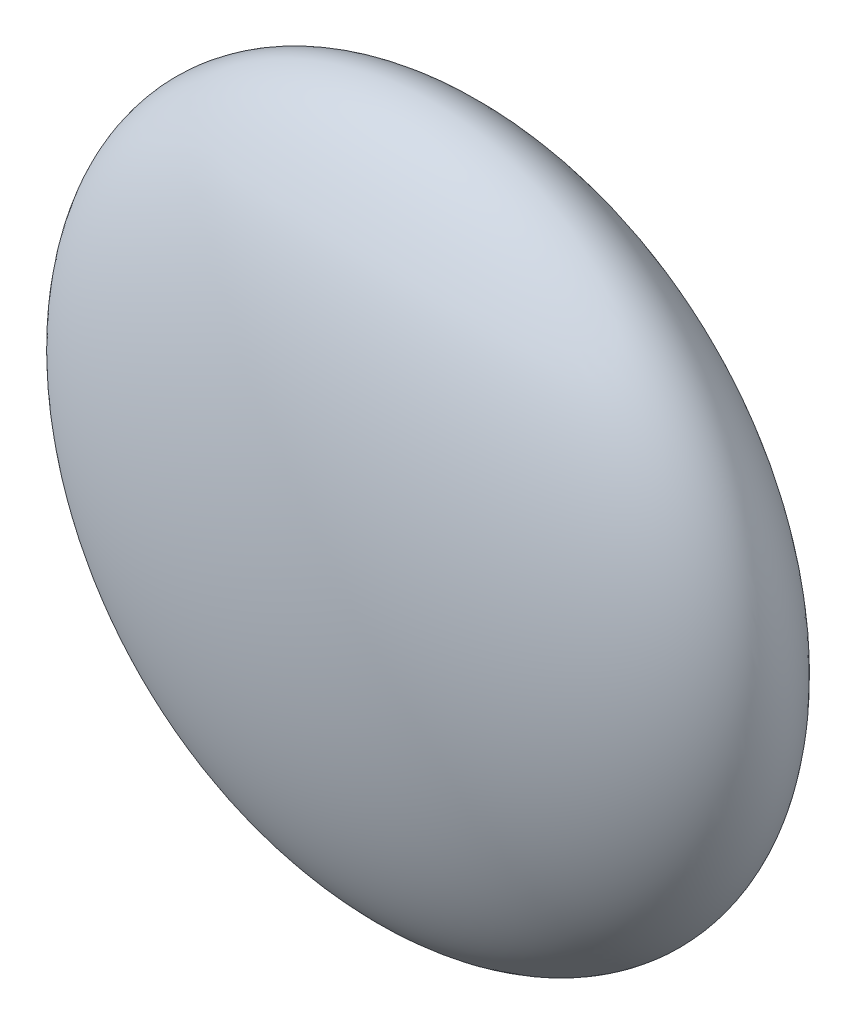
ISO-10303-21;
HEADER;
FILE_DESCRIPTION(('STEP AP214'),'2;1');
FILE_NAME('part.step','',(''),(''),'','','');
FILE_SCHEMA(('AUTOMOTIVE_DESIGN { 1 0 10303 214 1 1 1 1 }'));
ENDSEC;
DATA;
#1=APPLICATION_CONTEXT('core data for automotive mechanical design processes');
#2=APPLICATION_PROTOCOL_DEFINITION('international standard','automotive_design',2000,#1);
#3=PRODUCT_CONTEXT('',#1,'mechanical');
#4=PRODUCT('Part','Part','',(#3));
#5=PRODUCT_RELATED_PRODUCT_CATEGORY('part','',(#4));
#6=PRODUCT_DEFINITION_FORMATION('','',#4);
#7=PRODUCT_DEFINITION_CONTEXT('part definition',#1,'design');
#8=PRODUCT_DEFINITION('design','',#6,#7);
#9=PRODUCT_DEFINITION_SHAPE('','',#8);
#10=(LENGTH_UNIT() NAMED_UNIT(*) SI_UNIT(.MILLI.,.METRE.));
#11=(NAMED_UNIT(*) PLANE_ANGLE_UNIT() SI_UNIT($,.RADIAN.));
#12=(NAMED_UNIT(*) SI_UNIT($,.STERADIAN.) SOLID_ANGLE_UNIT());
#13=UNCERTAINTY_MEASURE_WITH_UNIT(LENGTH_MEASURE(1.E-05),#10,'distance_accuracy_value','');
#14=(GEOMETRIC_REPRESENTATION_CONTEXT(3) GLOBAL_UNCERTAINTY_ASSIGNED_CONTEXT((#13)) GLOBAL_UNIT_ASSIGNED_CONTEXT((#10,
#11,#12)) REPRESENTATION_CONTEXT('',''));
#15=CARTESIAN_POINT('',(0.,0.,0.));
#16=DIRECTION('',(0.,0.,1.));
#17=DIRECTION('',(1.,0.,0.));
#18=AXIS2_PLACEMENT_3D('',#15,#16,#17);
#19=CARTESIAN_POINT('',(0.,0.,0.));
#20=DIRECTION('',(1.,0.,0.));
#21=DIRECTION('',(0.,1.,0.));
#22=AXIS2_PLACEMENT_3D('',#19,#20,#21);
#23=ELLIPSE('',#22,0.625,0.242);
#24=TRIMMED_CURVE('',#23,(PARAMETER_VALUE(4.71238898038469)),
(PARAMETER_VALUE(7.85398163397448)),.T.,.PARAMETER.);
#25=CARTESIAN_POINT('',(0.,0.,0.242));
#26=DIRECTION('',(0.,0.,1.));
#27=AXIS1_PLACEMENT('',#25,#26);
#28=SURFACE_OF_REVOLUTION('',#24,#27);
#29=CARTESIAN_POINT('',(0.,0.,0.242));
#30=VERTEX_POINT('',#29);
#31=VERTEX_LOOP('',#30);
#32=FACE_BOUND('',#31,.T.);
#33=CARTESIAN_POINT('',(0.,0.,-0.242));
#34=VERTEX_POINT('',#33);
#35=VERTEX_LOOP('',#34);
#36=FACE_BOUND('',#35,.T.);
#37=ADVANCED_FACE('F38',(#32,#36),#28,.T.);
#38=CLOSED_SHELL('',(#37));
#39=MANIFOLD_SOLID_BREP('B2',#38);
#40=ADVANCED_BREP_SHAPE_REPRESENTATION('',(#18,#39),#14);
#41=SHAPE_DEFINITION_REPRESENTATION(#9,#40);
ENDSEC;
END-ISO-10303-21;
